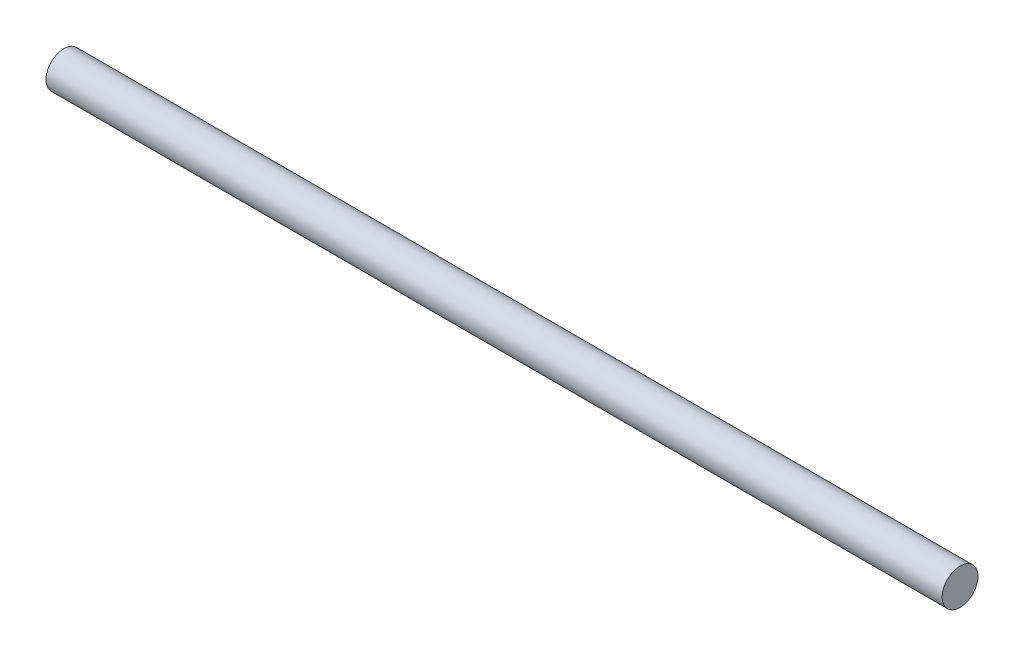
ISO-10303-21;
HEADER;
FILE_DESCRIPTION(('STEP AP214'),'2;1');
FILE_NAME('part.step','',(''),(''),'','','');
FILE_SCHEMA(('AUTOMOTIVE_DESIGN { 1 0 10303 214 1 1 1 1 }'));
ENDSEC;
DATA;
#1=APPLICATION_CONTEXT('core data for automotive mechanical design processes');
#2=APPLICATION_PROTOCOL_DEFINITION('international standard','automotive_design',2000,#1);
#3=PRODUCT_CONTEXT('',#1,'mechanical');
#4=PRODUCT('Part','Part','',(#3));
#5=PRODUCT_RELATED_PRODUCT_CATEGORY('part','',(#4));
#6=PRODUCT_DEFINITION_FORMATION('','',#4);
#7=PRODUCT_DEFINITION_CONTEXT('part definition',#1,'design');
#8=PRODUCT_DEFINITION('design','',#6,#7);
#9=PRODUCT_DEFINITION_SHAPE('','',#8);
#10=(LENGTH_UNIT() NAMED_UNIT(*) SI_UNIT(.MILLI.,.METRE.));
#11=(NAMED_UNIT(*) PLANE_ANGLE_UNIT() SI_UNIT($,.RADIAN.));
#12=(NAMED_UNIT(*) SI_UNIT($,.STERADIAN.) SOLID_ANGLE_UNIT());
#13=UNCERTAINTY_MEASURE_WITH_UNIT(LENGTH_MEASURE(1.E-05),#10,'distance_accuracy_value','');
#14=(GEOMETRIC_REPRESENTATION_CONTEXT(3) GLOBAL_UNCERTAINTY_ASSIGNED_CONTEXT((#13)) GLOBAL_UNIT_ASSIGNED_CONTEXT((#10,
#11,#12)) REPRESENTATION_CONTEXT('',''));
#15=CARTESIAN_POINT('',(0.,0.,0.));
#16=DIRECTION('',(0.,0.,1.));
#17=DIRECTION('',(1.,0.,0.));
#18=AXIS2_PLACEMENT_3D('',#15,#16,#17);
#19=CARTESIAN_POINT('',(500.,0.,0.));
#20=DIRECTION('',(-1.,0.,0.));
#21=DIRECTION('',(0.,0.,1.));
#22=AXIS2_PLACEMENT_3D('',#19,#20,#21);
#23=CYLINDRICAL_SURFACE('',#22,10.);
#24=CARTESIAN_POINT('',(500.,0.,0.));
#25=DIRECTION('',(1.,0.,0.));
#26=DIRECTION('',(0.,0.,-1.));
#27=AXIS2_PLACEMENT_3D('',#24,#25,#26);
#28=CIRCLE('',#27,10.);
#29=CARTESIAN_POINT('',(500.,0.,-10.));
#30=VERTEX_POINT('',#29);
#31=EDGE_CURVE('E10',#30,#30,#28,.T.);
#32=ORIENTED_EDGE('',*,*,#31,.F.);
#33=EDGE_LOOP('',(#32));
#34=FACE_BOUND('',#33,.T.);
#35=CARTESIAN_POINT('',(0.,0.,0.));
#36=DIRECTION('',(1.,0.,0.));
#37=DIRECTION('',(0.,0.,-1.));
#38=AXIS2_PLACEMENT_3D('',#35,#36,#37);
#39=CIRCLE('',#38,10.);
#40=CARTESIAN_POINT('',(0.,0.,-10.));
#41=VERTEX_POINT('',#40);
#42=EDGE_CURVE('E34',#41,#41,#39,.T.);
#43=ORIENTED_EDGE('',*,*,#42,.T.);
#44=EDGE_LOOP('',(#43));
#45=FACE_BOUND('',#44,.T.);
#46=ADVANCED_FACE('F31',(#34,#45),#23,.T.);
#47=CARTESIAN_POINT('',(500.,0.,0.));
#48=DIRECTION('',(1.,0.,0.));
#49=DIRECTION('',(0.,0.,-1.));
#50=AXIS2_PLACEMENT_3D('',#47,#48,#49);
#51=PLANE('',#50);
#52=ORIENTED_EDGE('',*,*,#31,.T.);
#53=EDGE_LOOP('',(#52));
#54=FACE_BOUND('',#53,.T.);
#55=ADVANCED_FACE('F46',(#54),#51,.T.);
#56=CARTESIAN_POINT('',(0.,0.,0.));
#57=DIRECTION('',(1.,0.,0.));
#58=DIRECTION('',(0.,0.,-1.));
#59=AXIS2_PLACEMENT_3D('',#56,#57,#58);
#60=PLANE('',#59);
#61=ORIENTED_EDGE('',*,*,#42,.F.);
#62=EDGE_LOOP('',(#61));
#63=FACE_BOUND('',#62,.T.);
#64=ADVANCED_FACE('F44',(#63),#60,.F.);
#65=CLOSED_SHELL('',(#46,#55,#64));
#66=MANIFOLD_SOLID_BREP('B2',#65);
#67=ADVANCED_BREP_SHAPE_REPRESENTATION('',(#18,#66),#14);
#68=SHAPE_DEFINITION_REPRESENTATION(#9,#67);
ENDSEC;
END-ISO-10303-21;
